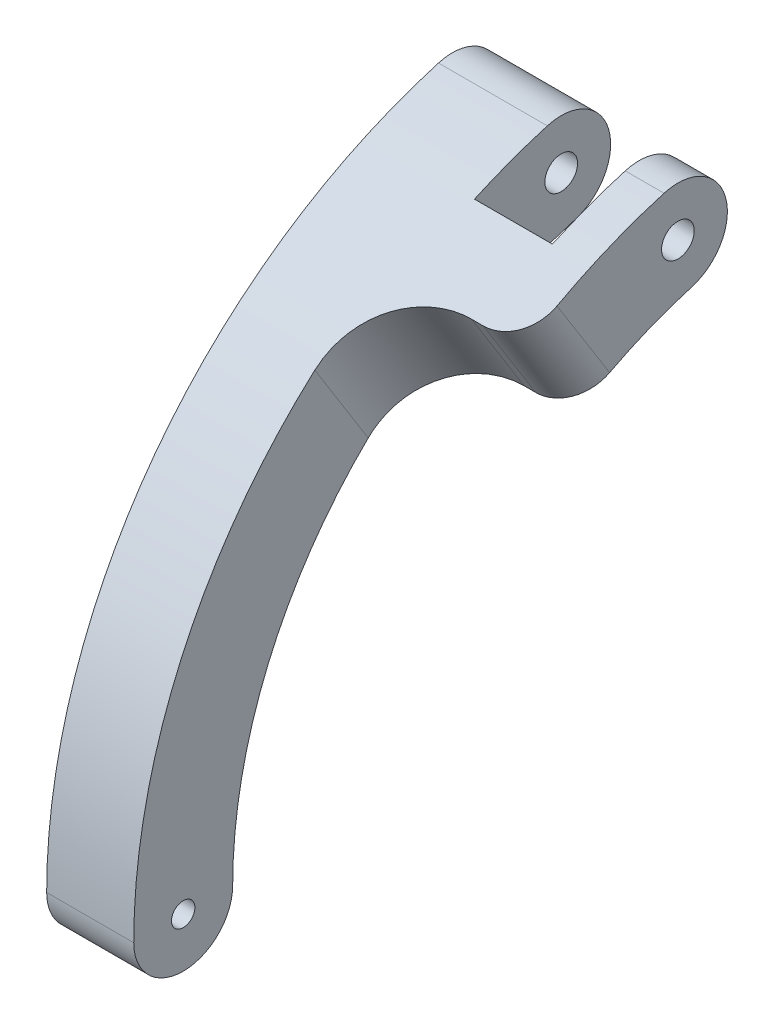
ISO-10303-21;
HEADER;
FILE_DESCRIPTION(('STEP AP214'),'2;1');
FILE_NAME('part.step','',(''),(''),'','','');
FILE_SCHEMA(('AUTOMOTIVE_DESIGN { 1 0 10303 214 1 1 1 1 }'));
ENDSEC;
DATA;
#1=APPLICATION_CONTEXT('core data for automotive mechanical design processes');
#2=APPLICATION_PROTOCOL_DEFINITION('international standard','automotive_design',2000,#1);
#3=PRODUCT_CONTEXT('',#1,'mechanical');
#4=PRODUCT('Part','Part','',(#3));
#5=PRODUCT_RELATED_PRODUCT_CATEGORY('part','',(#4));
#6=PRODUCT_DEFINITION_FORMATION('','',#4);
#7=PRODUCT_DEFINITION_CONTEXT('part definition',#1,'design');
#8=PRODUCT_DEFINITION('design','',#6,#7);
#9=PRODUCT_DEFINITION_SHAPE('','',#8);
#10=(LENGTH_UNIT() NAMED_UNIT(*) SI_UNIT(.MILLI.,.METRE.));
#11=(NAMED_UNIT(*) PLANE_ANGLE_UNIT() SI_UNIT($,.RADIAN.));
#12=(NAMED_UNIT(*) SI_UNIT($,.STERADIAN.) SOLID_ANGLE_UNIT());
#13=UNCERTAINTY_MEASURE_WITH_UNIT(LENGTH_MEASURE(1.E-05),#10,'distance_accuracy_value','');
#14=(GEOMETRIC_REPRESENTATION_CONTEXT(3) GLOBAL_UNCERTAINTY_ASSIGNED_CONTEXT((#13)) GLOBAL_UNIT_ASSIGNED_CONTEXT((#10,
#11,#12)) REPRESENTATION_CONTEXT('',''));
#15=CARTESIAN_POINT('',(0.,0.,0.));
#16=DIRECTION('',(0.,0.,1.));
#17=DIRECTION('',(1.,0.,0.));
#18=AXIS2_PLACEMENT_3D('',#15,#16,#17);
#19=CARTESIAN_POINT('',(5.588,0.,0.));
#20=DIRECTION('',(-1.,0.,0.));
#21=DIRECTION('',(0.,0.,1.));
#22=AXIS2_PLACEMENT_3D('',#19,#20,#21);
#23=CYLINDRICAL_SURFACE('',#22,28.575);
#24=CARTESIAN_POINT('',(14.478,0.,0.));
#25=DIRECTION('',(-1.,0.,0.));
#26=DIRECTION('',(0.,0.,-1.));
#27=AXIS2_PLACEMENT_3D('',#24,#25,#26);
#28=CIRCLE('',#27,28.575);
#29=CARTESIAN_POINT('',(14.478,25.3053289074532,13.2729406645858));
#30=VERTEX_POINT('',#29);
#31=CARTESIAN_POINT('',(14.478,27.432,8.00099999999999));
#32=VERTEX_POINT('',#31);
#33=EDGE_CURVE('E222',#30,#32,#28,.T.);
#34=ORIENTED_EDGE('',*,*,#33,.F.);
#35=CARTESIAN_POINT('',(14.478,25.3053289074532,13.2729406645858));
#36=CARTESIAN_POINT('',(14.4780069411029,25.2721962680013,13.3361147595674));
#37=CARTESIAN_POINT('',(14.4750121295149,25.2388236928847,13.3991602255743));
#38=CARTESIAN_POINT('',(14.4630619919268,25.1718487265518,13.524558058173));
#39=CARTESIAN_POINT('',(14.4541068394899,25.1382463420559,13.5869104448933));
#40=CARTESIAN_POINT('',(14.4302878817538,25.0710848786369,13.7104439773059));
#41=CARTESIAN_POINT('',(14.4154284830234,25.0375257861011,13.7716259609022));
#42=CARTESIAN_POINT('',(14.3799141891177,24.9707016491142,13.8924245159804));
#43=CARTESIAN_POINT('',(14.3592594016077,24.9374365992123,13.952041116521));
#44=CARTESIAN_POINT('',(14.2887546196299,24.8384431170109,14.1280006349831));
#45=CARTESIAN_POINT('',(14.2303567466913,24.7734953673275,14.2414917741396));
#46=CARTESIAN_POINT('',(14.0924954274718,24.6480706970933,14.4574856962185));
#47=CARTESIAN_POINT('',(14.0130361424429,24.5875928963983,14.559990644148));
#48=CARTESIAN_POINT('',(13.8353810632333,24.4732712575514,14.7513400739257));
#49=CARTESIAN_POINT('',(13.7372077336457,24.4194195915525,14.8402007060027));
#50=CARTESIAN_POINT('',(13.5248223470222,24.3202535377408,15.0021645364801));
#51=CARTESIAN_POINT('',(13.4106069360097,24.2749409398733,15.0752644316027));
#52=CARTESIAN_POINT('',(13.1691965709636,24.1945194967294,15.2040008347168));
#53=CARTESIAN_POINT('',(13.0419802956931,24.1594277884495,15.2596080256731));
#54=CARTESIAN_POINT('',(12.778346916188,24.1009320407776,15.3518305085021));
#55=CARTESIAN_POINT('',(12.6419350629992,24.0775213941386,15.3884565372865));
#56=CARTESIAN_POINT('',(12.4102751824999,24.0490054628536,15.4329649837049));
#57=CARTESIAN_POINT('',(12.3164645388069,24.040399477045,15.4463592014934));
#58=CARTESIAN_POINT('',(12.127782252452,24.0289084680319,15.4642236773029));
#59=CARTESIAN_POINT('',(12.0329122527581,24.0260155656994,15.4687062257991));
#60=CARTESIAN_POINT('',(11.938,24.0260275600579,15.4686982220011));
#61=B_SPLINE_CURVE_WITH_KNOTS('',3,(#35,#36,#37,#38,#39,#40,#41,#42,#43,#44,#45,#46,#47,#48,#49,
#50,#51,#52,#53,#54,#55,#56,#57,#58,#59,#60),.UNSPECIFIED.,.F.,.F.,(4,2,2,2,2,2,2,2,2,2,2,2,4),
(0.,0.213938095997272,0.427869962454853,0.641642462239762,0.855410990877023,1.28281628875417,
1.71013720401604,2.1369483514547,2.56384886706115,2.99146108446835,3.41883115338315,
3.70372919737966,3.98823405262445),.UNSPECIFIED.);
#62=CARTESIAN_POINT('',(11.938,24.0260275600579,15.4686982220011));
#63=VERTEX_POINT('',#62);
#64=EDGE_CURVE('E63',#30,#63,#61,.T.);
#65=ORIENTED_EDGE('',*,*,#64,.T.);
#66=DIRECTION('',(-1.,0.,0.));
#67=VECTOR('',#66,1.);
#68=CARTESIAN_POINT('',(14.478,24.0260275600579,15.4686982220011));
#69=LINE('',#68,#67);
#70=CARTESIAN_POINT('',(11.176,24.0260275600579,15.4686982220011));
#71=VERTEX_POINT('',#70);
#72=EDGE_CURVE('E228',#63,#71,#69,.T.);
#73=ORIENTED_EDGE('',*,*,#72,.T.);
#74=CARTESIAN_POINT('',(11.176,24.0260275600579,15.4686982220011));
#75=CARTESIAN_POINT('',(11.0189443629764,24.0260284332777,15.4686788654342));
#76=CARTESIAN_POINT('',(10.8618910731379,24.0224430341488,15.4742651522496));
#77=CARTESIAN_POINT('',(10.5489062384894,24.008105920638,15.4965092510779));
#78=CARTESIAN_POINT('',(10.3929746443452,23.9973545234021,15.5131665731193));
#79=CARTESIAN_POINT('',(10.0834399050987,23.9687012462103,15.5573981781409));
#80=CARTESIAN_POINT('',(9.92983526963643,23.9508041629074,15.5849651377482));
#81=CARTESIAN_POINT('',(9.62593998210242,23.907873810318,15.65074267659));
#82=CARTESIAN_POINT('',(9.4756492879101,23.8828406317884,15.6889531204606));
#83=CARTESIAN_POINT('',(9.17939860334885,23.8256522955397,15.7756651451388));
#84=CARTESIAN_POINT('',(9.03344008806987,23.7934947428421,15.8241701864181));
#85=CARTESIAN_POINT('',(8.74689392196116,23.722088316913,15.931016263881));
#86=CARTESIAN_POINT('',(8.6063082710728,23.6828368336611,15.9893609197554));
#87=CARTESIAN_POINT('',(8.33164307631833,23.5973333096359,16.1152806640735));
#88=CARTESIAN_POINT('',(8.19756010968896,23.5510850057125,16.1828508235088));
#89=CARTESIAN_POINT('',(7.93673522372253,23.4516431653654,16.3266254023096));
#90=CARTESIAN_POINT('',(7.80999586165839,23.3984472302947,16.4028328024477));
#91=CARTESIAN_POINT('',(7.56507284052024,23.2853637488259,16.5629720947831));
#92=CARTESIAN_POINT('',(7.44687202745146,23.2254902706038,16.646887684));
#93=CARTESIAN_POINT('',(7.21958464517373,23.0991300883425,16.8217849607818));
#94=CARTESIAN_POINT('',(7.11049801859021,23.0326434259397,16.9127666038583));
#95=CARTESIAN_POINT('',(6.90219413682489,22.8932604516201,17.1009637565337));
#96=CARTESIAN_POINT('',(6.80297901285836,22.8203627619622,17.1981806048682));
#97=CARTESIAN_POINT('',(6.61517930146587,22.6684749047004,17.3978906712501));
#98=CARTESIAN_POINT('',(6.52659095360645,22.5894869085875,17.5003820043918));
#99=CARTESIAN_POINT('',(6.3611039315446,22.4262180553295,17.7091168170224));
#100=CARTESIAN_POINT('',(6.28413977051865,22.3419709427783,17.8153347766679));
#101=CARTESIAN_POINT('',(6.14181650502212,22.1682061013237,18.0310965590451));
#102=CARTESIAN_POINT('',(6.07645319694866,22.0786902972673,18.1406391601656));
#103=CARTESIAN_POINT('',(5.95770249052425,21.894822885644,18.3621366021309));
#104=CARTESIAN_POINT('',(5.90431500301031,21.8004713140872,18.4740914250093));
#105=CARTESIAN_POINT('',(5.8098256925707,21.6075051497193,18.6994217168376));
#106=CARTESIAN_POINT('',(5.76872135185733,21.5088914353084,18.8127968896744));
#107=CARTESIAN_POINT('',(5.68519270960845,21.2682046996807,19.0850403227439));
#108=CARTESIAN_POINT('',(5.64865577417601,21.1243464226638,19.2441954329839));
#109=CARTESIAN_POINT('',(5.61221240016997,20.9046642090879,19.4817173075315));
#110=CARTESIAN_POINT('',(5.60312490596733,20.8308303534713,19.5606453506383));
#111=CARTESIAN_POINT('',(5.59101988453527,20.6820473965564,19.7178918027579));
#112=CARTESIAN_POINT('',(5.5880014520916,20.6070984632546,19.7962103009497));
#113=CARTESIAN_POINT('',(5.588,20.5316846845408,19.8741175656831));
#114=B_SPLINE_CURVE_WITH_KNOTS('',3,(#74,#75,#76,#77,#78,#79,#80,#81,#82,#83,#84,#85,#86,#87,
#88,#89,#90,#91,#92,#93,#94,#95,#96,#97,#98,#99,#100,#101,#102,#103,#104,#105,#106,#107,#108,
#109,#110,#111,#112,#113),.UNSPECIFIED.,.F.,.F.,(4,2,2,2,2,2,2,2,2,2,2,2,2,2,2,2,2,2,2,4),(0.,
0.471023403672035,0.942025962623213,1.41271288391272,1.88339381927011,2.35423322270134,
2.82524621276788,3.29600852733965,3.76693380284651,4.2368850396735,4.70683331789429,
5.17688283678181,5.64676552830284,6.11389349741349,6.58085185422207,7.04780673429303,
7.5146658326395,8.16586601224132,8.4910999267628,8.8162853283132),.UNSPECIFIED.);
#115=CARTESIAN_POINT('',(5.588,20.5316846845408,19.8741175656831));
#116=VERTEX_POINT('',#115);
#117=EDGE_CURVE('E180',#71,#116,#114,.T.);
#118=ORIENTED_EDGE('',*,*,#117,.T.);
#119=CARTESIAN_POINT('',(5.588,0.,0.));
#120=DIRECTION('',(-1.,0.,0.));
#121=DIRECTION('',(0.,0.,1.));
#122=AXIS2_PLACEMENT_3D('',#119,#120,#121);
#123=CIRCLE('',#122,28.575);
#124=CARTESIAN_POINT('',(5.588,0.,28.575));
#125=VERTEX_POINT('',#124);
#126=EDGE_CURVE('E252',#125,#116,#123,.T.);
#127=ORIENTED_EDGE('',*,*,#126,.F.);
#128=DIRECTION('',(-1.,0.,0.));
#129=VECTOR('',#128,1.);
#130=CARTESIAN_POINT('',(5.588,0.,28.575));
#131=LINE('',#130,#129);
#132=CARTESIAN_POINT('',(0.,0.,28.575));
#133=VERTEX_POINT('',#132);
#134=EDGE_CURVE('E167',#125,#133,#131,.T.);
#135=ORIENTED_EDGE('',*,*,#134,.T.);
#136=CARTESIAN_POINT('',(0.,0.,0.));
#137=DIRECTION('',(-1.,0.,0.));
#138=DIRECTION('',(0.,0.,1.));
#139=AXIS2_PLACEMENT_3D('',#136,#137,#138);
#140=CIRCLE('',#139,28.575);
#141=CARTESIAN_POINT('',(0.,27.432,8.00099999999999));
#142=VERTEX_POINT('',#141);
#143=EDGE_CURVE('E258',#133,#142,#140,.T.);
#144=ORIENTED_EDGE('',*,*,#143,.T.);
#145=DIRECTION('',(-1.,0.,0.));
#146=VECTOR('',#145,1.);
#147=CARTESIAN_POINT('',(5.588,27.432,8.00099999999999));
#148=LINE('',#147,#146);
#149=CARTESIAN_POINT('',(6.98778000000002,27.432,8.00099999999999));
#150=VERTEX_POINT('',#149);
#151=EDGE_CURVE('E158',#150,#142,#148,.T.);
#152=ORIENTED_EDGE('',*,*,#151,.F.);
#153=CARTESIAN_POINT('',(6.98778000000002,0.,0.));
#154=DIRECTION('',(-1.,0.,0.));
#155=DIRECTION('',(0.,1.,0.));
#156=AXIS2_PLACEMENT_3D('',#153,#154,#155);
#157=CIRCLE('',#156,28.575);
#158=CARTESIAN_POINT('',(6.98778000000002,25.9985341755384,11.8577757494128));
#159=VERTEX_POINT('',#158);
#160=EDGE_CURVE('E135',#159,#150,#157,.T.);
#161=ORIENTED_EDGE('',*,*,#160,.F.);
#162=DIRECTION('',(1.,0.,0.));
#163=VECTOR('',#162,1.);
#164=CARTESIAN_POINT('',(6.98778000000002,25.9985341755384,11.8577757494128));
#165=LINE('',#164,#163);
#166=CARTESIAN_POINT('',(11.98778,25.9985341755384,11.8577757494128));
#167=VERTEX_POINT('',#166);
#168=EDGE_CURVE('E436',#159,#167,#165,.T.);
#169=ORIENTED_EDGE('',*,*,#168,.T.);
#170=CARTESIAN_POINT('',(11.98778,0.,0.));
#171=DIRECTION('',(-1.,0.,0.));
#172=DIRECTION('',(0.,1.,0.));
#173=AXIS2_PLACEMENT_3D('',#170,#171,#172);
#174=CIRCLE('',#173,28.575);
#175=CARTESIAN_POINT('',(11.98778,27.432,8.00099999999999));
#176=VERTEX_POINT('',#175);
#177=EDGE_CURVE('E139',#167,#176,#174,.T.);
#178=ORIENTED_EDGE('',*,*,#177,.T.);
#179=EDGE_CURVE('E164',#32,#176,#148,.T.);
#180=ORIENTED_EDGE('',*,*,#179,.F.);
#181=EDGE_LOOP('',(#34,#65,#73,#118,#127,#135,#144,#152,#161,#169,#178,#180));
#182=FACE_BOUND('',#181,.T.);
#183=ADVANCED_FACE('F35',(#182),#23,.F.);
#184=CARTESIAN_POINT('',(5.588,30.48,8.88999999999999));
#185=DIRECTION('',(-1.,0.,0.));
#186=DIRECTION('',(0.,0.,1.));
#187=AXIS2_PLACEMENT_3D('',#184,#185,#186);
#188=CYLINDRICAL_SURFACE('',#187,3.175);
#189=CARTESIAN_POINT('',(6.98778000000002,30.48,8.88999999999999));
#190=DIRECTION('',(1.,0.,0.));
#191=DIRECTION('',(0.,1.,0.));
#192=AXIS2_PLACEMENT_3D('',#189,#190,#191);
#193=CIRCLE('',#192,3.175);
#194=CARTESIAN_POINT('',(6.98778000000002,33.528,9.77899999999999));
#195=VERTEX_POINT('',#194);
#196=EDGE_CURVE('E128',#150,#195,#193,.T.);
#197=ORIENTED_EDGE('',*,*,#196,.F.);
#198=ORIENTED_EDGE('',*,*,#151,.T.);
#199=CARTESIAN_POINT('',(0.,30.48,8.88999999999999));
#200=DIRECTION('',(1.,0.,0.));
#201=DIRECTION('',(0.,0.,-1.));
#202=AXIS2_PLACEMENT_3D('',#199,#200,#201);
#203=CIRCLE('',#202,3.175);
#204=CARTESIAN_POINT('',(0.,33.528,9.77899999999999));
#205=VERTEX_POINT('',#204);
#206=EDGE_CURVE('E152',#142,#205,#203,.T.);
#207=ORIENTED_EDGE('',*,*,#206,.T.);
#208=DIRECTION('',(-1.,0.,0.));
#209=VECTOR('',#208,1.);
#210=CARTESIAN_POINT('',(5.588,33.528,9.77899999999999));
#211=LINE('',#210,#209);
#212=EDGE_CURVE('E143',#195,#205,#211,.T.);
#213=ORIENTED_EDGE('',*,*,#212,.F.);
#214=EDGE_LOOP('',(#197,#198,#207,#213));
#215=FACE_BOUND('',#214,.T.);
#216=ADVANCED_FACE('F150',(#215),#188,.T.);
#217=CARTESIAN_POINT('',(5.588,0.,0.));
#218=DIRECTION('',(-1.,0.,0.));
#219=DIRECTION('',(0.,0.,1.));
#220=AXIS2_PLACEMENT_3D('',#217,#218,#219);
#221=CYLINDRICAL_SURFACE('',#220,34.925);
#222=DIRECTION('',(-1.,0.,0.));
#223=VECTOR('',#222,1.);
#224=CARTESIAN_POINT('',(14.478,29.4100464778108,18.8362626646851));
#225=LINE('',#224,#223);
#226=CARTESIAN_POINT('',(11.938,29.4100464778108,18.8362626646851));
#227=VERTEX_POINT('',#226);
#228=CARTESIAN_POINT('',(11.176,29.4100464778108,18.8362626646851));
#229=VERTEX_POINT('',#228);
#230=EDGE_CURVE('E231',#227,#229,#225,.T.);
#231=ORIENTED_EDGE('',*,*,#230,.F.);
#232=CARTESIAN_POINT('',(11.938,29.4100464778108,18.8362626646851));
#233=CARTESIAN_POINT('',(12.0094409119174,29.4100414000498,18.8362675649945));
#234=CARTESIAN_POINT('',(12.0808785676551,29.4116721070238,18.8337244053585));
#235=CARTESIAN_POINT('',(12.2232426733763,29.4181664337427,18.8235802947337));
#236=CARTESIAN_POINT('',(12.2941691480112,29.4230298965214,18.8159795893134));
#237=CARTESIAN_POINT('',(12.4349601076135,29.4359462114002,18.7957663358375));
#238=CARTESIAN_POINT('',(12.5048253533608,29.443996654722,18.7831575729397));
#239=CARTESIAN_POINT('',(12.6430302961958,29.4632017233853,18.7530180346529));
#240=CARTESIAN_POINT('',(12.7113700116286,29.4743563113765,18.7354873184869));
#241=CARTESIAN_POINT('',(12.913441420816,29.5123486594905,18.6756304409306));
#242=CARTESIAN_POINT('',(13.0442828482824,29.5437203424077,18.6260312792102));
#243=CARTESIAN_POINT('',(13.2941608159098,29.6173348006966,18.508750992486));
#244=CARTESIAN_POINT('',(13.4131993821821,29.6595757057366,18.4410729783415));
#245=CARTESIAN_POINT('',(13.6362013213281,29.7533896913996,18.2893237350488));
#246=CARTESIAN_POINT('',(13.7401662491594,29.8049618082032,18.2052541989086));
#247=CARTESIAN_POINT('',(13.9300722298509,29.9156060582513,18.0228602110457));
#248=CARTESIAN_POINT('',(14.0160101122479,29.9746795078468,17.9245332569682));
#249=CARTESIAN_POINT('',(14.1673440736652,30.0982161523974,17.7163099853287));
#250=CARTESIAN_POINT('',(14.2327555343954,30.1626752654549,17.6064224137006));
#251=CARTESIAN_POINT('',(14.3412545336065,30.2948656954358,17.3779775536008));
#252=CARTESIAN_POINT('',(14.3843545997156,30.3625951526845,17.259425173104));
#253=CARTESIAN_POINT('',(14.4364206225228,30.4759293186941,17.0581891141272));
#254=CARTESIAN_POINT('',(14.4520071208805,30.5212401588689,16.9769899693096));
#255=CARTESIAN_POINT('',(14.4727956996765,30.6116990702848,16.8133376552112));
#256=CARTESIAN_POINT('',(14.4780126114783,30.6568472816726,16.7308864471729));
#257=CARTESIAN_POINT('',(14.478,30.7016713515766,16.6482131539628));
#258=B_SPLINE_CURVE_WITH_KNOTS('',3,(#232,#233,#234,#235,#236,#237,#238,#239,#240,#241,#242,
#243,#244,#245,#246,#247,#248,#249,#250,#251,#252,#253,#254,#255,#256,#257),.UNSPECIFIED.,.F.,
.F.,(4,2,2,2,2,2,2,2,2,2,2,2,4),(0.,0.214253010959329,0.428495619650908,0.642576608067726,
0.85665502068659,1.28463912568623,1.71254963410484,2.14041596892251,2.5683574907262,
2.9959775595881,3.42335726285104,3.70566472570144,3.987568119783),.UNSPECIFIED.);
#259=CARTESIAN_POINT('',(14.478,30.7016713515766,16.6482131539628));
#260=VERTEX_POINT('',#259);
#261=EDGE_CURVE('E11',#227,#260,#258,.T.);
#262=ORIENTED_EDGE('',*,*,#261,.T.);
#263=CARTESIAN_POINT('',(14.478,0.,0.));
#264=DIRECTION('',(1.,0.,0.));
#265=DIRECTION('',(0.,0.,-1.));
#266=AXIS2_PLACEMENT_3D('',#263,#264,#265);
#267=CIRCLE('',#266,34.925);
#268=CARTESIAN_POINT('',(14.478,33.528,9.77899999999999));
#269=VERTEX_POINT('',#268);
#270=EDGE_CURVE('E229',#269,#260,#267,.T.);
#271=ORIENTED_EDGE('',*,*,#270,.F.);
#272=CARTESIAN_POINT('',(11.98778,33.528,9.77899999999999));
#273=VERTEX_POINT('',#272);
#274=EDGE_CURVE('E154',#269,#273,#211,.T.);
#275=ORIENTED_EDGE('',*,*,#274,.T.);
#276=CARTESIAN_POINT('',(11.98778,0.,0.));
#277=DIRECTION('',(1.,0.,0.));
#278=DIRECTION('',(0.,1.,0.));
#279=AXIS2_PLACEMENT_3D('',#276,#277,#278);
#280=CIRCLE('',#279,34.925);
#281=CARTESIAN_POINT('',(11.98778,31.7932056476701,14.4550233360226));
#282=VERTEX_POINT('',#281);
#283=EDGE_CURVE('E434',#273,#282,#280,.T.);
#284=ORIENTED_EDGE('',*,*,#283,.T.);
#285=DIRECTION('',(1.,0.,0.));
#286=VECTOR('',#285,1.);
#287=CARTESIAN_POINT('',(6.98778000000002,31.7932056476701,14.4550233360226));
#288=LINE('',#287,#286);
#289=CARTESIAN_POINT('',(6.98778000000002,31.7932056476701,14.4550233360226));
#290=VERTEX_POINT('',#289);
#291=EDGE_CURVE('E147',#290,#282,#288,.T.);
#292=ORIENTED_EDGE('',*,*,#291,.F.);
#293=CARTESIAN_POINT('',(6.98778000000002,0.,0.));
#294=DIRECTION('',(1.,0.,0.));
#295=DIRECTION('',(0.,1.,0.));
#296=AXIS2_PLACEMENT_3D('',#293,#294,#295);
#297=CIRCLE('',#296,34.925);
#298=EDGE_CURVE('E132',#195,#290,#297,.T.);
#299=ORIENTED_EDGE('',*,*,#298,.F.);
#300=ORIENTED_EDGE('',*,*,#212,.T.);
#301=CARTESIAN_POINT('',(0.,0.,0.));
#302=DIRECTION('',(1.,0.,0.));
#303=DIRECTION('',(0.,0.,1.));
#304=AXIS2_PLACEMENT_3D('',#301,#302,#303);
#305=CIRCLE('',#304,34.925);
#306=CARTESIAN_POINT('',(0.,0.,34.925));
#307=VERTEX_POINT('',#306);
#308=EDGE_CURVE('E253',#205,#307,#305,.T.);
#309=ORIENTED_EDGE('',*,*,#308,.T.);
#310=DIRECTION('',(-1.,0.,0.));
#311=VECTOR('',#310,1.);
#312=CARTESIAN_POINT('',(5.588,0.,34.925));
#313=LINE('',#312,#311);
#314=CARTESIAN_POINT('',(5.588,0.,34.925));
#315=VERTEX_POINT('',#314);
#316=EDGE_CURVE('E155',#315,#307,#313,.T.);
#317=ORIENTED_EDGE('',*,*,#316,.F.);
#318=CARTESIAN_POINT('',(5.588,0.,0.));
#319=DIRECTION('',(1.,0.,0.));
#320=DIRECTION('',(0.,0.,1.));
#321=AXIS2_PLACEMENT_3D('',#318,#319,#320);
#322=CIRCLE('',#321,34.925);
#323=CARTESIAN_POINT('',(5.588,26.0138766070834,23.3030866811983));
#324=VERTEX_POINT('',#323);
#325=EDGE_CURVE('E160',#324,#315,#322,.T.);
#326=ORIENTED_EDGE('',*,*,#325,.F.);
#327=CARTESIAN_POINT('',(5.588,26.0138766070834,23.3030866811983));
#328=CARTESIAN_POINT('',(5.58798276179189,26.1188287379726,23.1859413739827));
#329=CARTESIAN_POINT('',(5.59444628190049,26.2229774802753,23.0680697935045));
#330=CARTESIAN_POINT('',(5.6203053964979,26.4289908580178,22.8317420806889));
#331=CARTESIAN_POINT('',(5.63970157176473,26.5308553906662,22.7132859223364));
#332=CARTESIAN_POINT('',(5.69138372879501,26.7315636762443,22.4767264155054));
#333=CARTESIAN_POINT('',(5.72366331171526,26.8304089025849,22.358622921162));
#334=CARTESIAN_POINT('',(5.80095296484982,27.0244988965965,22.1236365307063));
#335=CARTESIAN_POINT('',(5.84596250947137,27.1197438127325,22.0067535844069));
#336=CARTESIAN_POINT('',(5.9484968803358,27.3061292782987,21.7750558608582));
#337=CARTESIAN_POINT('',(6.00603146305291,27.3972665608783,21.6602427718601));
#338=CARTESIAN_POINT('',(6.1332552822961,27.5748638660381,21.4336938820451));
#339=CARTESIAN_POINT('',(6.20294900994562,27.6613221448587,21.3219592360068));
#340=CARTESIAN_POINT('',(6.35395775359084,27.8289986628169,21.1026420781528));
#341=CARTESIAN_POINT('',(6.43526467525847,27.9102204949723,20.9950567400765));
#342=CARTESIAN_POINT('',(6.60900411534192,28.0671101776836,20.7848541115506));
#343=CARTESIAN_POINT('',(6.70144048757765,28.1427760896933,20.6822385593472));
#344=CARTESIAN_POINT('',(6.89595874951292,28.2875762184493,20.4837405901849));
#345=CARTESIAN_POINT('',(6.99795504885518,28.3567590407728,20.3878097340211));
#346=CARTESIAN_POINT('',(7.21150943792032,28.4890046960921,20.2026034835837));
#347=CARTESIAN_POINT('',(7.32306753101731,28.5520675269282,20.1133280916584));
#348=CARTESIAN_POINT('',(7.55500554741352,28.6718639133576,19.942185518052));
#349=CARTESIAN_POINT('',(7.67538910382556,28.7285948378252,19.8603214186677));
#350=CARTESIAN_POINT('',(7.92404273347398,28.8354902855855,19.7047971064401));
#351=CARTESIAN_POINT('',(8.05231010732684,28.8856570382154,19.6311341095961));
#352=CARTESIAN_POINT('',(8.31617098235646,28.9794072441768,19.492475586459));
#353=CARTESIAN_POINT('',(8.45178090112021,29.0229750414212,19.4275007142988));
#354=CARTESIAN_POINT('',(8.72903837003443,29.1032556404418,19.307029187589));
#355=CARTESIAN_POINT('',(8.87068373763172,29.1399708948389,19.2515291424753));
#356=CARTESIAN_POINT('',(9.15902991416401,29.2064705088282,19.1504926210468));
#357=CARTESIAN_POINT('',(9.30572949547395,29.2362565380325,19.1049537447247));
#358=CARTESIAN_POINT('',(9.60311758884756,29.2888368956724,19.0242468577221));
#359=CARTESIAN_POINT('',(9.75380521533053,29.3116327624171,18.9890765653171));
#360=CARTESIAN_POINT('',(10.1140899354151,29.3572779369622,18.9184638286525));
#361=CARTESIAN_POINT('',(10.3250216135559,29.3770799829232,18.8876532300835));
#362=CARTESIAN_POINT('',(10.6432576091062,29.3968656741564,18.8568299777192));
#363=CARTESIAN_POINT('',(10.7495960828571,29.401808011651,18.8491210124724));
#364=CARTESIAN_POINT('',(10.9626135132669,29.408397407682,18.8388377879398));
#365=CARTESIAN_POINT('',(11.069292439226,29.4100447553743,18.8362630780915));
#366=CARTESIAN_POINT('',(11.176,29.4100464778108,18.8362626646851));
#367=B_SPLINE_CURVE_WITH_KNOTS('',3,(#327,#328,#329,#330,#331,#332,#333,#334,#335,#336,#337,
#338,#339,#340,#341,#342,#343,#344,#345,#346,#347,#348,#349,#350,#351,#352,#353,#354,#355,#356,
#357,#358,#359,#360,#361,#362,#363,#364,#365,#366),.UNSPECIFIED.,.F.,.F.,(4,2,2,2,2,2,2,2,2,2,2,
2,2,2,2,2,2,2,2,4),(0.,0.471720109979165,0.943461405331091,1.41496869041861,1.88645651082485,
2.35831292288288,2.83034399108067,3.30204764748624,3.77391511409348,4.24190136100837,
4.70988777306364,5.17806793126455,5.6460886701711,6.11520296262455,6.58414902916766,
7.05298198481628,7.52171169130719,8.16236743434077,8.48241729294375,8.80243906396188),.UNSPECIFIED.);
#368=EDGE_CURVE('E187',#324,#229,#367,.T.);
#369=ORIENTED_EDGE('',*,*,#368,.T.);
#370=EDGE_LOOP('',(#231,#262,#271,#275,#284,#292,#299,#300,#309,#317,#326,#369));
#371=FACE_BOUND('',#370,.T.);
#372=ADVANCED_FACE('F142',(#371),#221,.T.);
#373=CARTESIAN_POINT('',(5.588,0.,15.875));
#374=DIRECTION('',(1.,0.,0.));
#375=DIRECTION('',(0.,0.,-1.));
#376=AXIS2_PLACEMENT_3D('',#373,#374,#375);
#377=PLANE('',#376);
#378=ORIENTED_EDGE('',*,*,#126,.T.);
#379=DIRECTION('',(0.,-0.847817598968045,-0.53028795845282));
#380=VECTOR('',#379,1.);
#381=CARTESIAN_POINT('',(5.588,3.97566581547898,9.51875639263434));
#382=LINE('',#381,#380);
#383=EDGE_CURVE('E178',#116,#324,#382,.F.);
#384=ORIENTED_EDGE('',*,*,#383,.T.);
#385=ORIENTED_EDGE('',*,*,#325,.T.);
#386=CARTESIAN_POINT('',(5.588,0.,31.75));
#387=DIRECTION('',(1.,0.,0.));
#388=DIRECTION('',(0.,0.,-1.));
#389=AXIS2_PLACEMENT_3D('',#386,#387,#388);
#390=CIRCLE('',#389,3.175);
#391=EDGE_CURVE('E249',#315,#125,#390,.T.);
#392=ORIENTED_EDGE('',*,*,#391,.T.);
#393=EDGE_LOOP('',(#378,#384,#385,#392));
#394=FACE_BOUND('',#393,.T.);
#395=CARTESIAN_POINT('',(5.588,0.,31.75));
#396=DIRECTION('',(1.,0.,0.));
#397=DIRECTION('',(0.,0.,-1.));
#398=AXIS2_PLACEMENT_3D('',#395,#396,#397);
#399=CIRCLE('',#398,0.750000000000002);
#400=CARTESIAN_POINT('',(5.588,0.,31.));
#401=VERTEX_POINT('',#400);
#402=EDGE_CURVE('E240',#401,#401,#399,.T.);
#403=ORIENTED_EDGE('',*,*,#402,.F.);
#404=EDGE_LOOP('',(#403));
#405=FACE_BOUND('',#404,.T.);
#406=ADVANCED_FACE('F213',(#394,#405),#377,.T.);
#407=CARTESIAN_POINT('',(0.,0.,15.875));
#408=DIRECTION('',(1.,0.,0.));
#409=DIRECTION('',(0.,0.,-1.));
#410=AXIS2_PLACEMENT_3D('',#407,#408,#409);
#411=PLANE('',#410);
#412=CARTESIAN_POINT('',(0.,0.,31.75));
#413=DIRECTION('',(1.,0.,0.));
#414=DIRECTION('',(0.,0.,-1.));
#415=AXIS2_PLACEMENT_3D('',#412,#413,#414);
#416=CIRCLE('',#415,3.175);
#417=EDGE_CURVE('E248',#307,#133,#416,.T.);
#418=ORIENTED_EDGE('',*,*,#417,.F.);
#419=ORIENTED_EDGE('',*,*,#308,.F.);
#420=ORIENTED_EDGE('',*,*,#206,.F.);
#421=ORIENTED_EDGE('',*,*,#143,.F.);
#422=EDGE_LOOP('',(#418,#419,#420,#421));
#423=FACE_BOUND('',#422,.T.);
#424=CARTESIAN_POINT('',(0.,30.48,8.88999999999999));
#425=DIRECTION('',(1.,0.,0.));
#426=DIRECTION('',(0.,0.,-1.));
#427=AXIS2_PLACEMENT_3D('',#424,#425,#426);
#428=CIRCLE('',#427,1.05);
#429=CARTESIAN_POINT('',(0.,30.48,7.83999999999999));
#430=VERTEX_POINT('',#429);
#431=EDGE_CURVE('E243',#430,#430,#428,.T.);
#432=ORIENTED_EDGE('',*,*,#431,.T.);
#433=EDGE_LOOP('',(#432));
#434=FACE_BOUND('',#433,.T.);
#435=CARTESIAN_POINT('',(0.,0.,31.75));
#436=DIRECTION('',(1.,0.,0.));
#437=DIRECTION('',(0.,0.,-1.));
#438=AXIS2_PLACEMENT_3D('',#435,#436,#437);
#439=CIRCLE('',#438,0.750000000000002);
#440=CARTESIAN_POINT('',(0.,0.,31.));
#441=VERTEX_POINT('',#440);
#442=EDGE_CURVE('E239',#441,#441,#439,.T.);
#443=ORIENTED_EDGE('',*,*,#442,.T.);
#444=EDGE_LOOP('',(#443));
#445=FACE_BOUND('',#444,.T.);
#446=ADVANCED_FACE('F205',(#423,#434,#445),#411,.F.);
#447=CARTESIAN_POINT('',(5.588,0.,31.75));
#448=DIRECTION('',(-1.,0.,0.));
#449=DIRECTION('',(0.,0.,1.));
#450=AXIS2_PLACEMENT_3D('',#447,#448,#449);
#451=CYLINDRICAL_SURFACE('',#450,3.175);
#452=ORIENTED_EDGE('',*,*,#417,.T.);
#453=ORIENTED_EDGE('',*,*,#134,.F.);
#454=ORIENTED_EDGE('',*,*,#391,.F.);
#455=ORIENTED_EDGE('',*,*,#316,.T.);
#456=EDGE_LOOP('',(#452,#453,#454,#455));
#457=FACE_BOUND('',#456,.T.);
#458=ADVANCED_FACE('F201',(#457),#451,.T.);
#459=ORIENTED_EDGE('',*,*,#179,.T.);
#460=CARTESIAN_POINT('',(11.98778,30.48,8.88999999999999));
#461=DIRECTION('',(1.,0.,0.));
#462=DIRECTION('',(0.,1.,0.));
#463=AXIS2_PLACEMENT_3D('',#460,#461,#462);
#464=CIRCLE('',#463,3.175);
#465=EDGE_CURVE('E432',#176,#273,#464,.T.);
#466=ORIENTED_EDGE('',*,*,#465,.T.);
#467=ORIENTED_EDGE('',*,*,#274,.F.);
#468=CARTESIAN_POINT('',(14.478,30.48,8.88999999999999));
#469=DIRECTION('',(1.,0.,0.));
#470=DIRECTION('',(0.,0.,-1.));
#471=AXIS2_PLACEMENT_3D('',#468,#469,#470);
#472=CIRCLE('',#471,3.175);
#473=EDGE_CURVE('E234',#32,#269,#472,.T.);
#474=ORIENTED_EDGE('',*,*,#473,.F.);
#475=EDGE_LOOP('',(#459,#466,#467,#474));
#476=FACE_BOUND('',#475,.T.);
#477=ADVANCED_FACE('F204',(#476),#188,.T.);
#478=CARTESIAN_POINT('',(5.588,30.48,8.88999999999999));
#479=DIRECTION('',(-1.,0.,0.));
#480=DIRECTION('',(0.,0.,1.));
#481=AXIS2_PLACEMENT_3D('',#478,#479,#480);
#482=CYLINDRICAL_SURFACE('',#481,1.05);
#483=ORIENTED_EDGE('',*,*,#431,.F.);
#484=EDGE_LOOP('',(#483));
#485=FACE_BOUND('',#484,.T.);
#486=CARTESIAN_POINT('',(6.98778000000002,30.48,8.88999999999999));
#487=DIRECTION('',(1.,0.,0.));
#488=DIRECTION('',(0.,1.,0.));
#489=AXIS2_PLACEMENT_3D('',#486,#487,#488);
#490=CIRCLE('',#489,1.05);
#491=CARTESIAN_POINT('',(6.98778000000002,31.53,8.88999999999999));
#492=VERTEX_POINT('',#491);
#493=EDGE_CURVE('E174',#492,#492,#490,.T.);
#494=ORIENTED_EDGE('',*,*,#493,.T.);
#495=EDGE_LOOP('',(#494));
#496=FACE_BOUND('',#495,.T.);
#497=ADVANCED_FACE('F211',(#485,#496),#482,.F.);
#498=CARTESIAN_POINT('',(5.588,0.,31.75));
#499=DIRECTION('',(-1.,0.,0.));
#500=DIRECTION('',(0.,0.,1.));
#501=AXIS2_PLACEMENT_3D('',#498,#499,#500);
#502=CYLINDRICAL_SURFACE('',#501,0.750000000000002);
#503=ORIENTED_EDGE('',*,*,#402,.T.);
#504=EDGE_LOOP('',(#503));
#505=FACE_BOUND('',#504,.T.);
#506=ORIENTED_EDGE('',*,*,#442,.F.);
#507=EDGE_LOOP('',(#506));
#508=FACE_BOUND('',#507,.T.);
#509=ADVANCED_FACE('F295',(#505,#508),#502,.F.);
#510=CARTESIAN_POINT('',(14.478,30.48,8.88999999999999));
#511=DIRECTION('',(1.,0.,0.));
#512=DIRECTION('',(0.,0.,-1.));
#513=AXIS2_PLACEMENT_3D('',#510,#511,#512);
#514=PLANE('',#513);
#515=CARTESIAN_POINT('',(14.478,30.48,8.88999999999999));
#516=DIRECTION('',(-1.,0.,0.));
#517=DIRECTION('',(0.,0.,1.));
#518=AXIS2_PLACEMENT_3D('',#515,#516,#517);
#519=CIRCLE('',#518,1.05);
#520=CARTESIAN_POINT('',(14.478,30.48,9.93999999999999));
#521=VERTEX_POINT('',#520);
#522=EDGE_CURVE('E175',#521,#521,#519,.T.);
#523=ORIENTED_EDGE('',*,*,#522,.T.);
#524=EDGE_LOOP('',(#523));
#525=FACE_BOUND('',#524,.T.);
#526=ORIENTED_EDGE('',*,*,#270,.T.);
#527=DIRECTION('',(0.,-0.847817598968045,-0.53028795845282));
#528=VECTOR('',#527,1.);
#529=CARTESIAN_POINT('',(14.478,25.372958974528,13.3152415206223));
#530=LINE('',#529,#528);
#531=EDGE_CURVE('E274',#260,#30,#530,.T.);
#532=ORIENTED_EDGE('',*,*,#531,.T.);
#533=ORIENTED_EDGE('',*,*,#33,.T.);
#534=ORIENTED_EDGE('',*,*,#473,.T.);
#535=EDGE_LOOP('',(#526,#532,#533,#534));
#536=FACE_BOUND('',#535,.T.);
#537=ADVANCED_FACE('F281',(#525,#536),#514,.T.);
#538=CARTESIAN_POINT('',(14.478,24.0260275600579,15.4686982220011));
#539=DIRECTION('',(0.,0.53028795845282,-0.847817598968045));
#540=DIRECTION('',(0.,0.847817598968045,0.53028795845282));
#541=AXIS2_PLACEMENT_3D('',#538,#539,#540);
#542=PLANE('',#541);
#543=ORIENTED_EDGE('',*,*,#72,.F.);
#544=DIRECTION('',(0.,-0.847817598968045,-0.53028795845282));
#545=VECTOR('',#544,1.);
#546=CARTESIAN_POINT('',(11.938,29.4100464778108,18.8362626646851));
#547=LINE('',#546,#545);
#548=EDGE_CURVE('E49',#63,#227,#547,.F.);
#549=ORIENTED_EDGE('',*,*,#548,.T.);
#550=ORIENTED_EDGE('',*,*,#230,.T.);
#551=DIRECTION('',(0.,-0.847817598968045,-0.53028795845282));
#552=VECTOR('',#551,1.);
#553=CARTESIAN_POINT('',(11.176,24.0260275600579,15.4686982220011));
#554=LINE('',#553,#552);
#555=EDGE_CURVE('E170',#229,#71,#554,.T.);
#556=ORIENTED_EDGE('',*,*,#555,.T.);
#557=EDGE_LOOP('',(#543,#549,#550,#556));
#558=FACE_BOUND('',#557,.T.);
#559=ADVANCED_FACE('F285',(#558),#542,.F.);
#560=CARTESIAN_POINT('',(6.98778000000002,25.9985341755384,11.8577757494128));
#561=DIRECTION('',(0.,-0.409008204259605,0.91253070570164));
#562=DIRECTION('',(0.,-0.91253070570164,-0.409008204259605));
#563=AXIS2_PLACEMENT_3D('',#560,#561,#562);
#564=PLANE('',#563);
#565=DIRECTION('',(0.,-0.91253070570164,-0.409008204259605));
#566=VECTOR('',#565,1.);
#567=CARTESIAN_POINT('',(11.98778,25.9985341755384,11.8577757494128));
#568=LINE('',#567,#566);
#569=EDGE_CURVE('E437',#282,#167,#568,.T.);
#570=ORIENTED_EDGE('',*,*,#569,.T.);
#571=ORIENTED_EDGE('',*,*,#168,.F.);
#572=DIRECTION('',(0.,-0.91253070570164,-0.409008204259605));
#573=VECTOR('',#572,1.);
#574=CARTESIAN_POINT('',(6.98778000000002,25.9985341755384,11.8577757494128));
#575=LINE('',#574,#573);
#576=EDGE_CURVE('E148',#290,#159,#575,.T.);
#577=ORIENTED_EDGE('',*,*,#576,.F.);
#578=ORIENTED_EDGE('',*,*,#291,.T.);
#579=EDGE_LOOP('',(#570,#571,#577,#578));
#580=FACE_BOUND('',#579,.T.);
#581=ADVANCED_FACE('F287',(#580),#564,.F.);
#582=CARTESIAN_POINT('',(6.98778000000002,30.48,8.88999999999999));
#583=DIRECTION('',(1.,0.,0.));
#584=DIRECTION('',(0.,1.,0.));
#585=AXIS2_PLACEMENT_3D('',#582,#583,#584);
#586=PLANE('',#585);
#587=ORIENTED_EDGE('',*,*,#493,.F.);
#588=EDGE_LOOP('',(#587));
#589=FACE_BOUND('',#588,.T.);
#590=ORIENTED_EDGE('',*,*,#196,.T.);
#591=ORIENTED_EDGE('',*,*,#298,.T.);
#592=ORIENTED_EDGE('',*,*,#576,.T.);
#593=ORIENTED_EDGE('',*,*,#160,.T.);
#594=EDGE_LOOP('',(#590,#591,#592,#593));
#595=FACE_BOUND('',#594,.T.);
#596=ADVANCED_FACE('F130',(#589,#595),#586,.T.);
#597=CARTESIAN_POINT('',(11.98778,30.48,8.88999999999999));
#598=DIRECTION('',(1.,0.,0.));
#599=DIRECTION('',(0.,1.,0.));
#600=AXIS2_PLACEMENT_3D('',#597,#598,#599);
#601=PLANE('',#600);
#602=CARTESIAN_POINT('',(11.98778,30.48,8.88999999999999));
#603=DIRECTION('',(1.,0.,0.));
#604=DIRECTION('',(0.,1.,0.));
#605=AXIS2_PLACEMENT_3D('',#602,#603,#604);
#606=CIRCLE('',#605,1.05);
#607=CARTESIAN_POINT('',(11.98778,31.53,8.88999999999999));
#608=VERTEX_POINT('',#607);
#609=EDGE_CURVE('E171',#608,#608,#606,.T.);
#610=ORIENTED_EDGE('',*,*,#609,.T.);
#611=EDGE_LOOP('',(#610));
#612=FACE_BOUND('',#611,.T.);
#613=ORIENTED_EDGE('',*,*,#465,.F.);
#614=ORIENTED_EDGE('',*,*,#177,.F.);
#615=ORIENTED_EDGE('',*,*,#569,.F.);
#616=ORIENTED_EDGE('',*,*,#283,.F.);
#617=EDGE_LOOP('',(#613,#614,#615,#616));
#618=FACE_BOUND('',#617,.T.);
#619=ADVANCED_FACE('F373',(#612,#618),#601,.F.);
#620=CARTESIAN_POINT('',(14.478,30.48,8.88999999999999));
#621=DIRECTION('',(-1.,0.,0.));
#622=DIRECTION('',(0.,0.,1.));
#623=AXIS2_PLACEMENT_3D('',#620,#621,#622);
#624=CYLINDRICAL_SURFACE('',#623,1.05);
#625=ORIENTED_EDGE('',*,*,#522,.F.);
#626=EDGE_LOOP('',(#625));
#627=FACE_BOUND('',#626,.T.);
#628=ORIENTED_EDGE('',*,*,#609,.F.);
#629=EDGE_LOOP('',(#628));
#630=FACE_BOUND('',#629,.T.);
#631=ADVANCED_FACE('F199',(#627,#630),#624,.F.);
#632=CARTESIAN_POINT('',(11.176,21.0627784482235,20.2063029650345));
#633=DIRECTION('',(0.,-0.847817598968045,-0.53028795845282));
#634=DIRECTION('',(0.,0.53028795845282,-0.847817598968045));
#635=AXIS2_PLACEMENT_3D('',#632,#633,#634);
#636=CYLINDRICAL_SURFACE('',#635,5.588);
#637=ORIENTED_EDGE('',*,*,#368,.F.);
#638=ORIENTED_EDGE('',*,*,#383,.F.);
#639=ORIENTED_EDGE('',*,*,#117,.F.);
#640=ORIENTED_EDGE('',*,*,#555,.F.);
#641=EDGE_LOOP('',(#637,#638,#639,#640));
#642=FACE_BOUND('',#641,.T.);
#643=ADVANCED_FACE('F196',(#642),#636,.F.);
#644=CARTESIAN_POINT('',(11.938,27.0543397883948,14.3669016893336));
#645=DIRECTION('',(0.,0.847817598968045,0.53028795845282));
#646=DIRECTION('',(0.,-0.53028795845282,0.847817598968045));
#647=AXIS2_PLACEMENT_3D('',#644,#645,#646);
#648=CYLINDRICAL_SURFACE('',#647,2.54);
#649=ORIENTED_EDGE('',*,*,#261,.F.);
#650=ORIENTED_EDGE('',*,*,#548,.F.);
#651=ORIENTED_EDGE('',*,*,#64,.F.);
#652=ORIENTED_EDGE('',*,*,#531,.F.);
#653=EDGE_LOOP('',(#649,#650,#651,#652));
#654=FACE_BOUND('',#653,.T.);
#655=ADVANCED_FACE('F37',(#654),#648,.T.);
#656=CLOSED_SHELL('',(#183,#216,#372,#406,#446,#458,#477,#497,#509,#537,#559,#581,#596,#619,
#631,#643,#655));
#657=MANIFOLD_SOLID_BREP('B2',#656);
#658=ADVANCED_BREP_SHAPE_REPRESENTATION('',(#18,#657),#14);
#659=SHAPE_DEFINITION_REPRESENTATION(#9,#658);
ENDSEC;
END-ISO-10303-21;
